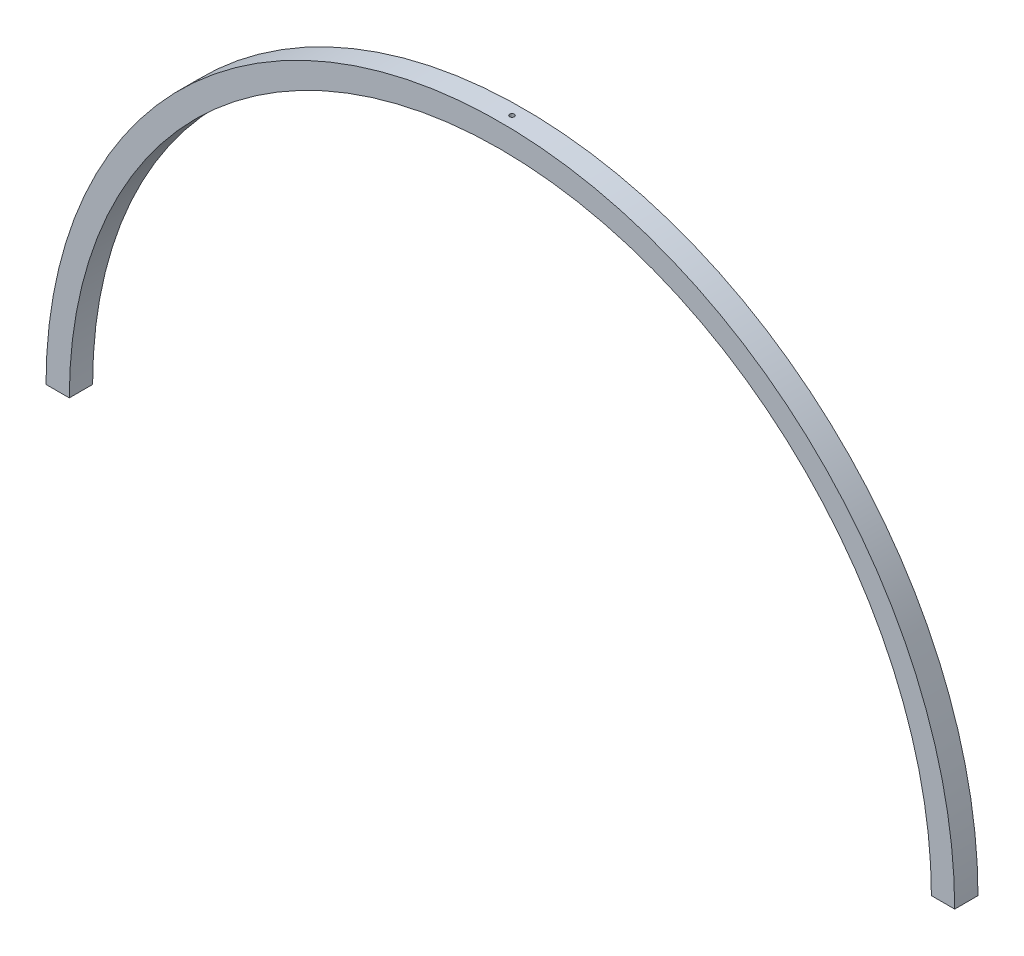
ISO-10303-21;
HEADER;
FILE_DESCRIPTION(('STEP AP214'),'2;1');
FILE_NAME('part.step','',(''),(''),'','','');
FILE_SCHEMA(('AUTOMOTIVE_DESIGN { 1 0 10303 214 1 1 1 1 }'));
ENDSEC;
DATA;
#1=APPLICATION_CONTEXT('core data for automotive mechanical design processes');
#2=APPLICATION_PROTOCOL_DEFINITION('international standard','automotive_design',2000,#1);
#3=PRODUCT_CONTEXT('',#1,'mechanical');
#4=PRODUCT('Part','Part','',(#3));
#5=PRODUCT_RELATED_PRODUCT_CATEGORY('part','',(#4));
#6=PRODUCT_DEFINITION_FORMATION('','',#4);
#7=PRODUCT_DEFINITION_CONTEXT('part definition',#1,'design');
#8=PRODUCT_DEFINITION('design','',#6,#7);
#9=PRODUCT_DEFINITION_SHAPE('','',#8);
#10=(LENGTH_UNIT() NAMED_UNIT(*) SI_UNIT(.MILLI.,.METRE.));
#11=(NAMED_UNIT(*) PLANE_ANGLE_UNIT() SI_UNIT($,.RADIAN.));
#12=(NAMED_UNIT(*) SI_UNIT($,.STERADIAN.) SOLID_ANGLE_UNIT());
#13=UNCERTAINTY_MEASURE_WITH_UNIT(LENGTH_MEASURE(1.E-05),#10,'distance_accuracy_value','');
#14=(GEOMETRIC_REPRESENTATION_CONTEXT(3) GLOBAL_UNCERTAINTY_ASSIGNED_CONTEXT((#13)) GLOBAL_UNIT_ASSIGNED_CONTEXT((#10,
#11,#12)) REPRESENTATION_CONTEXT('',''));
#15=CARTESIAN_POINT('',(0.,0.,0.));
#16=DIRECTION('',(0.,0.,1.));
#17=DIRECTION('',(1.,0.,0.));
#18=AXIS2_PLACEMENT_3D('',#15,#16,#17);
#19=CARTESIAN_POINT('',(195.,0.,10.));
#20=DIRECTION('',(0.,-1.,0.));
#21=DIRECTION('',(0.,0.,-1.));
#22=AXIS2_PLACEMENT_3D('',#19,#20,#21);
#23=PLANE('',#22);
#24=DIRECTION('',(0.,0.,1.));
#25=VECTOR('',#24,1.);
#26=CARTESIAN_POINT('',(185.,0.,-230.));
#27=LINE('',#26,#25);
#28=CARTESIAN_POINT('',(185.,0.,0.));
#29=VERTEX_POINT('',#28);
#30=CARTESIAN_POINT('',(185.,0.,10.));
#31=VERTEX_POINT('',#30);
#32=EDGE_CURVE('E189',#29,#31,#27,.T.);
#33=ORIENTED_EDGE('',*,*,#32,.F.);
#34=DIRECTION('',(-1.,0.,0.));
#35=VECTOR('',#34,1.);
#36=CARTESIAN_POINT('',(195.,0.,0.));
#37=LINE('',#36,#35);
#38=CARTESIAN_POINT('',(195.,0.,0.));
#39=VERTEX_POINT('',#38);
#40=EDGE_CURVE('E180',#39,#29,#37,.T.);
#41=ORIENTED_EDGE('',*,*,#40,.F.);
#42=DIRECTION('',(0.,0.,-1.));
#43=VECTOR('',#42,1.);
#44=CARTESIAN_POINT('',(195.,0.,10.));
#45=LINE('',#44,#43);
#46=CARTESIAN_POINT('',(195.,0.,10.));
#47=VERTEX_POINT('',#46);
#48=EDGE_CURVE('E12',#47,#39,#45,.T.);
#49=ORIENTED_EDGE('',*,*,#48,.F.);
#50=DIRECTION('',(-1.,0.,0.));
#51=VECTOR('',#50,1.);
#52=CARTESIAN_POINT('',(195.,0.,10.));
#53=LINE('',#52,#51);
#54=EDGE_CURVE('E199',#47,#31,#53,.T.);
#55=ORIENTED_EDGE('',*,*,#54,.T.);
#56=EDGE_LOOP('',(#33,#41,#49,#55));
#57=FACE_BOUND('',#56,.T.);
#58=ADVANCED_FACE('F128',(#57),#23,.T.);
#59=DIRECTION('',(0.,0.,1.));
#60=VECTOR('',#59,1.);
#61=CARTESIAN_POINT('',(-185.,0.,-230.));
#62=LINE('',#61,#60);
#63=CARTESIAN_POINT('',(-185.,0.,10.));
#64=VERTEX_POINT('',#63);
#65=CARTESIAN_POINT('',(-185.,0.,0.));
#66=VERTEX_POINT('',#65);
#67=EDGE_CURVE('E151',#64,#66,#62,.F.);
#68=ORIENTED_EDGE('',*,*,#67,.F.);
#69=CARTESIAN_POINT('',(-195.,0.,10.));
#70=VERTEX_POINT('',#69);
#71=EDGE_CURVE('E185',#64,#70,#53,.T.);
#72=ORIENTED_EDGE('',*,*,#71,.T.);
#73=DIRECTION('',(0.,0.,-1.));
#74=VECTOR('',#73,1.);
#75=CARTESIAN_POINT('',(-195.,0.,10.));
#76=LINE('',#75,#74);
#77=CARTESIAN_POINT('',(-195.,0.,0.));
#78=VERTEX_POINT('',#77);
#79=EDGE_CURVE('E143',#70,#78,#76,.T.);
#80=ORIENTED_EDGE('',*,*,#79,.T.);
#81=EDGE_CURVE('E182',#66,#78,#37,.T.);
#82=ORIENTED_EDGE('',*,*,#81,.F.);
#83=EDGE_LOOP('',(#68,#72,#80,#82));
#84=FACE_BOUND('',#83,.T.);
#85=ADVANCED_FACE('F130',(#84),#23,.T.);
#86=CARTESIAN_POINT('',(0.,0.,10.));
#87=DIRECTION('',(0.,0.,-1.));
#88=DIRECTION('',(-1.,0.,0.));
#89=AXIS2_PLACEMENT_3D('',#86,#87,#88);
#90=CYLINDRICAL_SURFACE('',#89,195.);
#91=CARTESIAN_POINT('',(0.,195.,4.));
#92=CARTESIAN_POINT('',(0.0561700427574793,194.999999965327,4.00000249071111));
#93=CARTESIAN_POINT('',(0.112380804679505,194.999975469612,4.00474849072458));
#94=CARTESIAN_POINT('',(0.223254227617488,194.999880106191,4.02361535169763));
#95=CARTESIAN_POINT('',(0.277914943033491,194.999809182684,4.0377474942359));
#96=CARTESIAN_POINT('',(0.384065952543839,194.999628998058,4.07498429589481));
#97=CARTESIAN_POINT('',(0.435557748428969,194.999519755267,4.09808466632844));
#98=CARTESIAN_POINT('',(0.533917824580092,194.99927526481,4.15259629093642));
#99=CARTESIAN_POINT('',(0.580787249943005,194.999140023609,4.18400547963689));
#100=CARTESIAN_POINT('',(0.668593964518465,194.998858748926,4.25424979700015));
#101=CARTESIAN_POINT('',(0.709530583657942,194.998712714227,4.29308576332348));
#102=CARTESIAN_POINT('',(0.784304319411508,194.998426323083,4.3770806822869));
#103=CARTESIAN_POINT('',(0.818141157104063,194.998285966862,4.42223988322501));
#104=CARTESIAN_POINT('',(0.877752499155994,194.998026765331,4.51759753176368));
#105=CARTESIAN_POINT('',(0.903527109287217,194.99790791974,4.56779591324165));
#106=CARTESIAN_POINT('',(0.946282825200784,194.997705136625,4.67180734408418));
#107=CARTESIAN_POINT('',(0.963263949178651,194.997621199029,4.72562038596902));
#108=CARTESIAN_POINT('',(0.987950614499664,194.997497695716,4.8353332309576));
#109=CARTESIAN_POINT('',(0.995656220884793,194.997458129688,4.89123301942579));
#110=CARTESIAN_POINT('',(1.00157329952117,194.997427829408,5.00353275221202));
#111=CARTESIAN_POINT('',(0.999784789487699,194.997437095065,5.05993269559662));
#112=CARTESIAN_POINT('',(0.986764512178179,194.997503412978,5.17163127407714));
#113=CARTESIAN_POINT('',(0.975532830252614,194.997560464802,5.22692991912233));
#114=CARTESIAN_POINT('',(0.943945159213854,194.997715922301,5.33485673785145));
#115=CARTESIAN_POINT('',(0.92358916016251,194.997814328021,5.38748490862664));
#116=CARTESIAN_POINT('',(0.874330605140921,194.998041399341,5.48857702841396));
#117=CARTESIAN_POINT('',(0.845428011055289,194.998170065076,5.53704095885351));
#118=CARTESIAN_POINT('',(0.779896766305261,194.998443150182,5.62842863238338));
#119=CARTESIAN_POINT('',(0.74326811816065,194.998587569548,5.67135237728059));
#120=CARTESIAN_POINT('',(0.66332402880329,194.998875881859,5.75044174709178));
#121=CARTESIAN_POINT('',(0.620008509698191,194.999019774797,5.78660729327172));
#122=CARTESIAN_POINT('',(0.527920547393154,194.999290809853,5.85115303103871));
#123=CARTESIAN_POINT('',(0.479148103475928,194.99941795197,5.87953322160241));
#124=CARTESIAN_POINT('',(0.377530761499701,194.999641151155,5.92770260205317));
#125=CARTESIAN_POINT('',(0.324685862518095,194.999737208217,5.94749178999394));
#126=CARTESIAN_POINT('',(0.216423740359311,194.999887407497,5.97791736072542));
#127=CARTESIAN_POINT('',(0.161006517499171,194.999941549721,5.98855374464421));
#128=CARTESIAN_POINT('',(0.0491735529694551,195.000001814811,6.00037167828602));
#129=CARTESIAN_POINT('',(-0.00724217731589871,195.000007938224,6.00155333573513));
#130=CARTESIAN_POINT('',(-0.119471277683584,194.999971476776,5.99442855304094));
#131=CARTESIAN_POINT('',(-0.175284647759941,194.999928891913,5.98612211280351));
#132=CARTESIAN_POINT('',(-0.284724351598063,194.999799815327,5.96025701791839));
#133=CARTESIAN_POINT('',(-0.338350696794177,194.999713323834,5.94269841165016));
#134=CARTESIAN_POINT('',(-0.441894401754199,194.999506185112,5.89882747363933));
#135=CARTESIAN_POINT('',(-0.491811761769894,194.999385537886,5.87251514249097));
#136=CARTESIAN_POINT('',(-0.586520988262376,194.999123688085,5.81188340898315));
#137=CARTESIAN_POINT('',(-0.631312808902113,194.998982485327,5.77756393502516));
#138=CARTESIAN_POINT('',(-0.714499007167161,194.998695444373,5.70189223388567));
#139=CARTESIAN_POINT('',(-0.752893381802226,194.998549606175,5.66054000341698));
#140=CARTESIAN_POINT('',(-0.822195132823353,194.998269734921,5.57197619164695));
#141=CARTESIAN_POINT('',(-0.85310243745302,194.998135701978,5.52476455419537));
#142=CARTESIAN_POINT('',(-0.906552163269164,194.997894554343,5.42582246767967));
#143=CARTESIAN_POINT('',(-0.929094593579837,194.997787439622,5.37409202354464));
#144=CARTESIAN_POINT('',(-0.965174574853684,194.997612205448,5.26758103769626));
#145=CARTESIAN_POINT('',(-0.97871217433128,194.997544085786,5.21280051241725));
#146=CARTESIAN_POINT('',(-0.996398378516396,194.997454521003,5.10174408542184));
#147=CARTESIAN_POINT('',(-1.0005469670395,194.997433075963,5.04546818112794));
#148=CARTESIAN_POINT('',(-0.999337333540501,194.997439278513,4.93301939701527));
#149=CARTESIAN_POINT('',(-0.993979238581673,194.997466925448,4.87684651582958));
#150=CARTESIAN_POINT('',(-0.973908568331291,194.997568193698,4.76619749332102));
#151=CARTESIAN_POINT('',(-0.959195974235458,194.997641815105,4.71172135540914));
#152=CARTESIAN_POINT('',(-0.920833638030294,194.99782673377,4.60601135312397));
#153=CARTESIAN_POINT('',(-0.897183729665313,194.997938031729,4.55477754908663));
#154=CARTESIAN_POINT('',(-0.84161912548042,194.998185749824,4.45700960392846));
#155=CARTESIAN_POINT('',(-0.8097047534301,194.998322168976,4.41047527879954));
#156=CARTESIAN_POINT('',(-0.738520541059489,194.998604739991,4.32342897541427));
#157=CARTESIAN_POINT('',(-0.699251386211936,194.998750890947,4.28291643655236));
#158=CARTESIAN_POINT('',(-0.614457557526827,194.999036498686,4.20904881216433));
#159=CARTESIAN_POINT('',(-0.568931331481624,194.999175953796,4.17569550792381));
#160=CARTESIAN_POINT('',(-0.472907480285744,194.99943246922,4.11709276167631));
#161=CARTESIAN_POINT('',(-0.422407467208873,194.999549518697,4.09184723725862));
#162=CARTESIAN_POINT('',(-0.31792537557956,194.999747797733,4.05022184511719));
#163=CARTESIAN_POINT('',(-0.263947558144782,194.999829070206,4.03383135072149));
#164=CARTESIAN_POINT('',(-0.174688187979035,194.999924794305,4.01474898989733));
#165=CARTESIAN_POINT('',(-0.139986605025111,194.999952874926,4.00922502297281));
#166=CARTESIAN_POINT('',(-0.0701953164853879,194.999990488608,4.00184974970713));
#167=CARTESIAN_POINT('',(-0.0351056109028529,195.00000002167,3.99999844333508));
#168=CARTESIAN_POINT('',(0.,195.,4.));
#169=B_SPLINE_CURVE_WITH_KNOTS('',3,(#91,#92,#93,#94,#95,#96,#97,#98,#99,#100,#101,#102,#103,
#104,#105,#106,#107,#108,#109,#110,#111,#112,#113,#114,#115,#116,#117,#118,#119,#120,#121,#122,
#123,#124,#125,#126,#127,#128,#129,#130,#131,#132,#133,#134,#135,#136,#137,#138,#139,#140,#141,
#142,#143,#144,#145,#146,#147,#148,#149,#150,#151,#152,#153,#154,#155,#156,#157,#158,#159,#160,
#161,#162,#163,#164,#165,#166,#167,#168),.UNSPECIFIED.,.T.,.F.,(4,2,2,2,2,2,2,2,2,2,2,2,2,2,2,2,
2,2,2,2,2,2,2,2,2,2,2,2,2,2,2,2,2,2,2,2,2,2,4),(0.,0.168381992750483,0.336966737668812,
0.505470962957349,0.673933339389158,0.842414727781486,1.01090273388347,1.1793885294258,
1.34787397633513,1.51635824178032,1.68484219284708,1.85332462111697,2.0218072328973,
2.19029059607355,2.35877390430046,2.52725917526168,2.69574446836956,2.86422979964747,
3.03271511015966,3.2011985009664,3.36968189344445,3.53816440493341,3.70664690498479,
3.87513091163614,4.04361499703883,4.21210069713624,4.38058621345311,4.54907082203011,
4.71755572103409,4.88603836813989,5.05452135392815,5.22300747406155,5.39148699456141,
5.55995082041694,5.72845651321086,5.89704350401415,6.0654277263599,6.17066447677132,
6.27590122629754),.UNSPECIFIED.);
#170=CARTESIAN_POINT('',(0.,195.,4.));
#171=VERTEX_POINT('',#170);
#172=EDGE_CURVE('E193',#171,#171,#169,.T.);
#173=ORIENTED_EDGE('',*,*,#172,.T.);
#174=EDGE_LOOP('',(#173));
#175=FACE_BOUND('',#174,.T.);
#176=CARTESIAN_POINT('',(0.,0.,0.));
#177=DIRECTION('',(0.,0.,1.));
#178=DIRECTION('',(1.,0.,0.));
#179=AXIS2_PLACEMENT_3D('',#176,#177,#178);
#180=CIRCLE('',#179,195.);
#181=EDGE_CURVE('E173',#39,#78,#180,.T.);
#182=ORIENTED_EDGE('',*,*,#181,.T.);
#183=ORIENTED_EDGE('',*,*,#79,.F.);
#184=CARTESIAN_POINT('',(0.,0.,10.));
#185=DIRECTION('',(0.,0.,1.));
#186=DIRECTION('',(1.,0.,0.));
#187=AXIS2_PLACEMENT_3D('',#184,#185,#186);
#188=CIRCLE('',#187,195.);
#189=EDGE_CURVE('E175',#47,#70,#188,.T.);
#190=ORIENTED_EDGE('',*,*,#189,.F.);
#191=ORIENTED_EDGE('',*,*,#48,.T.);
#192=EDGE_LOOP('',(#182,#183,#190,#191));
#193=FACE_BOUND('',#192,.T.);
#194=ADVANCED_FACE('F171',(#175,#193),#90,.T.);
#195=CARTESIAN_POINT('',(0.,0.,10.));
#196=DIRECTION('',(0.,0.,1.));
#197=DIRECTION('',(1.,0.,0.));
#198=AXIS2_PLACEMENT_3D('',#195,#196,#197);
#199=PLANE('',#198);
#200=CARTESIAN_POINT('',(0.,0.,10.));
#201=DIRECTION('',(0.,0.,1.));
#202=DIRECTION('',(1.,0.,0.));
#203=AXIS2_PLACEMENT_3D('',#200,#201,#202);
#204=CIRCLE('',#203,185.);
#205=EDGE_CURVE('E242',#31,#64,#204,.T.);
#206=ORIENTED_EDGE('',*,*,#205,.F.);
#207=ORIENTED_EDGE('',*,*,#54,.F.);
#208=ORIENTED_EDGE('',*,*,#189,.T.);
#209=ORIENTED_EDGE('',*,*,#71,.F.);
#210=EDGE_LOOP('',(#206,#207,#208,#209));
#211=FACE_BOUND('',#210,.T.);
#212=ADVANCED_FACE('F222',(#211),#199,.T.);
#213=CARTESIAN_POINT('',(0.,0.,0.));
#214=DIRECTION('',(0.,0.,1.));
#215=DIRECTION('',(1.,0.,0.));
#216=AXIS2_PLACEMENT_3D('',#213,#214,#215);
#217=PLANE('',#216);
#218=ORIENTED_EDGE('',*,*,#40,.T.);
#219=CARTESIAN_POINT('',(0.,0.,0.));
#220=DIRECTION('',(0.,0.,1.));
#221=DIRECTION('',(1.,0.,0.));
#222=AXIS2_PLACEMENT_3D('',#219,#220,#221);
#223=CIRCLE('',#222,185.);
#224=EDGE_CURVE('E240',#29,#66,#223,.T.);
#225=ORIENTED_EDGE('',*,*,#224,.T.);
#226=ORIENTED_EDGE('',*,*,#81,.T.);
#227=ORIENTED_EDGE('',*,*,#181,.F.);
#228=EDGE_LOOP('',(#218,#225,#226,#227));
#229=FACE_BOUND('',#228,.T.);
#230=ADVANCED_FACE('F179',(#229),#217,.F.);
#231=CARTESIAN_POINT('',(0.,250.,5.));
#232=DIRECTION('',(0.,-1.,0.));
#233=DIRECTION('',(0.,0.,-1.));
#234=AXIS2_PLACEMENT_3D('',#231,#232,#233);
#235=CYLINDRICAL_SURFACE('',#234,1.);
#236=CARTESIAN_POINT('',(0.,185.,4.));
#237=CARTESIAN_POINT('',(0.0561699987643519,184.999999963453,4.0000024906963));
#238=CARTESIAN_POINT('',(0.11238071561792,184.999974143686,4.00474848330447));
#239=CARTESIAN_POINT('',(0.223254046643,184.999873625645,4.02361531314919));
#240=CARTESIAN_POINT('',(0.27791471526249,184.999798868555,4.03774743166667));
#241=CARTESIAN_POINT('',(0.384065630941757,184.999608944514,4.0749841657652));
#242=CARTESIAN_POINT('',(0.43555737990926,184.999493796884,4.09808449233191));
#243=CARTESIAN_POINT('',(0.533917371535847,184.999236091078,4.15259600962107));
#244=CARTESIAN_POINT('',(0.580786759221734,184.999093539716,4.18400513499724));
#245=CARTESIAN_POINT('',(0.668593455494542,184.998797061135,4.25424934185339));
#246=CARTESIAN_POINT('',(0.709530088595011,184.998643132623,4.29308526776181));
#247=CARTESIAN_POINT('',(0.784303862364998,184.99834126067,4.37708010832127));
#248=CARTESIAN_POINT('',(0.818140724100742,184.998193317465,4.42223927128165));
#249=CARTESIAN_POINT('',(0.877752143298278,184.997920104531,4.51759688180315));
#250=CARTESIAN_POINT('',(0.903526801603803,184.997794834518,4.56779526632225));
#251=CARTESIAN_POINT('',(0.946282610189101,184.997581089484,4.67180671944942));
#252=CARTESIAN_POINT('',(0.963263778721366,184.997492614386,4.72561978055429));
#253=CARTESIAN_POINT('',(0.987950511956366,184.997362434697,4.83533262310196));
#254=CARTESIAN_POINT('',(0.99565615088585,184.997320729731,4.89123238784237));
#255=CARTESIAN_POINT('',(1.00157330083936,184.997288791168,5.00353208031875));
#256=CARTESIAN_POINT('',(0.999784829646089,184.997298557474,5.05993200711771));
#257=CARTESIAN_POINT('',(0.98676464274239,184.99736845976,5.1716304979503));
#258=CARTESIAN_POINT('',(0.975533022250442,184.997428595231,5.22692907308347));
#259=CARTESIAN_POINT('',(0.943945500344341,184.997592455331,5.33485576232717));
#260=CARTESIAN_POINT('',(0.923589588958082,184.997696180006,5.38748387351903));
#261=CARTESIAN_POINT('',(0.874331221624814,184.997935524963,5.4885759183177));
#262=CARTESIAN_POINT('',(0.845428723022011,184.998071145403,5.53703983113955));
#263=CARTESIAN_POINT('',(0.779897682158745,184.998358991537,5.62842748999056));
#264=CARTESIAN_POINT('',(0.743269142350609,184.998511217225,5.67135123777822));
#265=CARTESIAN_POINT('',(0.663325223648003,184.998815114046,5.75044069128225));
#266=CARTESIAN_POINT('',(0.620009758314377,184.998966785172,5.78660630962569));
#267=CARTESIAN_POINT('',(0.527921886126884,184.999252471274,5.85115220117204));
#268=CARTESIAN_POINT('',(0.479149478555263,184.999386486248,5.87953247335094));
#269=CARTESIAN_POINT('',(0.37753218600141,184.999621750971,5.92770202322454));
#270=CARTESIAN_POINT('',(0.324687299974519,184.999723000713,5.9474912987155));
#271=CARTESIAN_POINT('',(0.216425182084915,184.999881319727,5.97791704284727));
#272=CARTESIAN_POINT('',(0.161007950561576,184.999938389003,5.98855351269563));
#273=CARTESIAN_POINT('',(0.0491750223265703,185.000001912502,6.00037160351875));
#274=CARTESIAN_POINT('',(-0.00724066173670741,185.000008367365,6.00155334418014));
#275=CARTESIAN_POINT('',(-0.119469683422408,184.999969935997,5.99442874201945));
#276=CARTESIAN_POINT('',(-0.175283021041205,184.999925049766,5.98612239914028));
#277=CARTESIAN_POINT('',(-0.28472264152107,184.999788997138,5.96025752019992));
#278=CARTESIAN_POINT('',(-0.338348937096478,184.999697831011,5.94269903793418));
#279=CARTESIAN_POINT('',(-0.441892565162782,184.999479496722,5.89882837108047));
#280=CARTESIAN_POINT('',(-0.491809897879607,184.999352328562,5.87251618702571));
#281=CARTESIAN_POINT('',(-0.586519148135399,184.999076325492,5.81188473571231));
#282=CARTESIAN_POINT('',(-0.631311014670736,184.998927490366,5.77756538878452));
#283=CARTESIAN_POINT('',(-0.714497329972751,184.998624933839,5.70189393795885));
#284=CARTESIAN_POINT('',(-0.752891775704701,184.998471212435,5.66054183072488));
#285=CARTESIAN_POINT('',(-0.822193732053476,184.998176212434,5.57197820694206));
#286=CARTESIAN_POINT('',(-0.853101163217055,184.998034933968,5.52476662821972));
#287=CARTESIAN_POINT('',(-0.906551149209532,184.997780750132,5.42582462956239));
#288=CARTESIAN_POINT('',(-0.929093713195242,184.997667844731,5.37409421457412));
#289=CARTESIAN_POINT('',(-0.965173951500727,184.997483137028,5.26758328580079));
#290=CARTESIAN_POINT('',(-0.978711679347289,184.997411334481,5.21280279014818));
#291=CARTESIAN_POINT('',(-0.996398142723863,184.997316926876,5.10174639639991));
#292=CARTESIAN_POINT('',(-1.000546862151,184.997294321902,5.04547049573967));
#293=CARTESIAN_POINT('',(-0.999337488837896,184.997300858329,4.93302176913216));
#294=CARTESIAN_POINT('',(-0.993979535256863,184.997329998972,4.87684894168815));
#295=CARTESIAN_POINT('',(-0.973909167054335,184.997436739774,4.76620000380165));
#296=CARTESIAN_POINT('',(-0.959196733629315,184.99751434003,4.71172389676999));
#297=CARTESIAN_POINT('',(-0.920834736157888,184.997709253022,4.6060139302998));
#298=CARTESIAN_POINT('',(-0.897185005879216,184.997826566496,4.55478013118836));
#299=CARTESIAN_POINT('',(-0.841620771098656,184.99808767375,4.4570121629333));
#300=CARTESIAN_POINT('',(-0.809706590282481,184.998231466491,4.41047780983024));
#301=CARTESIAN_POINT('',(-0.738522719924701,184.998529311227,4.32343135495676));
#302=CARTESIAN_POINT('',(-0.69925370647998,184.998683362277,4.28291870025201));
#303=CARTESIAN_POINT('',(-0.614460139381038,184.998984408656,4.20905081891201));
#304=CARTESIAN_POINT('',(-0.568934033533059,184.999131402222,4.17569737353402));
#305=CARTESIAN_POINT('',(-0.472910366219207,184.999401784391,4.11709430618757));
#306=CARTESIAN_POINT('',(-0.422410414089446,184.999525161558,4.09184860626498));
#307=CARTESIAN_POINT('',(-0.317928404912174,184.999734159945,4.05022285747372));
#308=CARTESIAN_POINT('',(-0.263950608955148,184.999819826397,4.03383218212224));
#309=CARTESIAN_POINT('',(-0.174690756440777,184.999920726796,4.01474942678878));
#310=CARTESIAN_POINT('',(-0.139988670838887,184.999950326157,4.00922529641786));
#311=CARTESIAN_POINT('',(-0.0701963586213741,184.99998997418,4.00184980470064));
#312=CARTESIAN_POINT('',(-0.0351061320093793,185.000000022842,3.99999844332001));
#313=CARTESIAN_POINT('',(0.,185.,4.));
#314=B_SPLINE_CURVE_WITH_KNOTS('',3,(#236,#237,#238,#239,#240,#241,#242,#243,#244,#245,#246,
#247,#248,#249,#250,#251,#252,#253,#254,#255,#256,#257,#258,#259,#260,#261,#262,#263,#264,#265,
#266,#267,#268,#269,#270,#271,#272,#273,#274,#275,#276,#277,#278,#279,#280,#281,#282,#283,#284,
#285,#286,#287,#288,#289,#290,#291,#292,#293,#294,#295,#296,#297,#298,#299,#300,#301,#302,#303,
#304,#305,#306,#307,#308,#309,#310,#311,#312,#313),.UNSPECIFIED.,.T.,.F.,(4,2,2,2,2,2,2,2,2,2,2,
2,2,2,2,2,2,2,2,2,2,2,2,2,2,2,2,2,2,2,2,2,2,2,2,2,2,2,4),(0.,0.168381858854091,
0.336966464713395,0.505470544693635,0.673932778338218,0.842414177566966,1.01090219480558,
1.17938810447643,1.34787366442261,1.51635787606639,1.68484177213534,1.85332396934446,
2.02180635069133,2.19028957294356,2.35877274171754,2.52725808858703,2.69574345761747,
2.86422886986733,3.03271425988863,3.201197517064,3.36968077525344,3.53816305382806,
3.70664532213974,3.87512926687652,4.04361329153636,4.21209910409392,4.38058473221368,
4.54906935880771,4.71755427436564,4.88603672365226,5.05451951160803,5.22300543347044,
5.39148475740607,5.55994860138531,5.72845431178956,5.89704141289923,6.06542574890547,
6.17066406028526,6.27590237068144),.UNSPECIFIED.);
#315=CARTESIAN_POINT('',(0.,185.,4.));
#316=VERTEX_POINT('',#315);
#317=EDGE_CURVE('E132',#316,#316,#314,.T.);
#318=ORIENTED_EDGE('',*,*,#317,.T.);
#319=EDGE_LOOP('',(#318));
#320=FACE_BOUND('',#319,.T.);
#321=ORIENTED_EDGE('',*,*,#172,.F.);
#322=EDGE_LOOP('',(#321));
#323=FACE_BOUND('',#322,.T.);
#324=ADVANCED_FACE('F215',(#320,#323),#235,.F.);
#325=CARTESIAN_POINT('',(0.,0.,-230.));
#326=DIRECTION('',(0.,0.,1.));
#327=DIRECTION('',(1.,0.,0.));
#328=AXIS2_PLACEMENT_3D('',#325,#326,#327);
#329=CYLINDRICAL_SURFACE('',#328,185.);
#330=ORIENTED_EDGE('',*,*,#32,.T.);
#331=ORIENTED_EDGE('',*,*,#205,.T.);
#332=ORIENTED_EDGE('',*,*,#67,.T.);
#333=ORIENTED_EDGE('',*,*,#224,.F.);
#334=EDGE_LOOP('',(#330,#331,#332,#333));
#335=FACE_BOUND('',#334,.T.);
#336=ORIENTED_EDGE('',*,*,#317,.F.);
#337=EDGE_LOOP('',(#336));
#338=FACE_BOUND('',#337,.T.);
#339=ADVANCED_FACE('F219',(#335,#338),#329,.F.);
#340=CLOSED_SHELL('',(#58,#85,#194,#212,#230,#324,#339));
#341=MANIFOLD_SOLID_BREP('B2',#340);
#342=ADVANCED_BREP_SHAPE_REPRESENTATION('',(#18,#341),#14);
#343=SHAPE_DEFINITION_REPRESENTATION(#9,#342);
ENDSEC;
END-ISO-10303-21;
